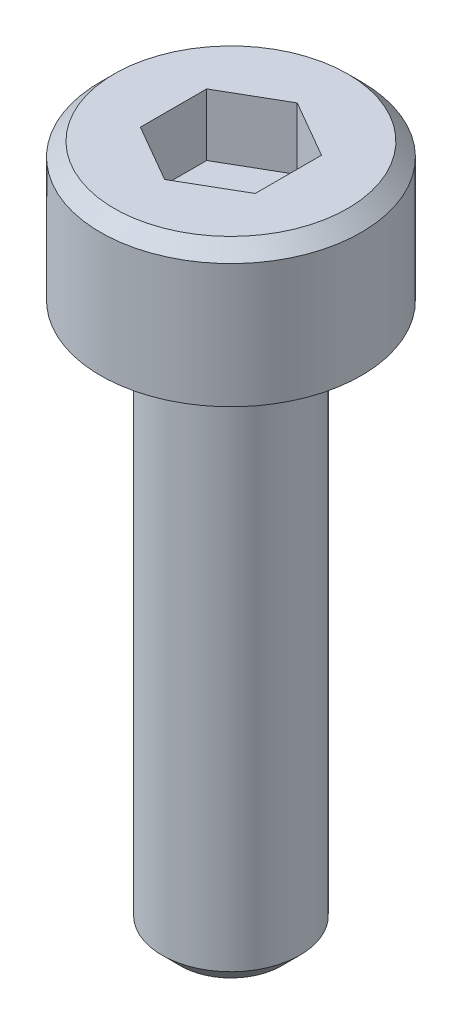
ISO-10303-21;
HEADER;
FILE_DESCRIPTION(('STEP AP214'),'2;1');
FILE_NAME('part.step','',(''),(''),'','','');
FILE_SCHEMA(('AUTOMOTIVE_DESIGN { 1 0 10303 214 1 1 1 1 }'));
ENDSEC;
DATA;
#1=APPLICATION_CONTEXT('core data for automotive mechanical design processes');
#2=APPLICATION_PROTOCOL_DEFINITION('international standard','automotive_design',2000,#1);
#3=PRODUCT_CONTEXT('',#1,'mechanical');
#4=PRODUCT('Part','Part','',(#3));
#5=PRODUCT_RELATED_PRODUCT_CATEGORY('part','',(#4));
#6=PRODUCT_DEFINITION_FORMATION('','',#4);
#7=PRODUCT_DEFINITION_CONTEXT('part definition',#1,'design');
#8=PRODUCT_DEFINITION('design','',#6,#7);
#9=PRODUCT_DEFINITION_SHAPE('','',#8);
#10=(LENGTH_UNIT() NAMED_UNIT(*) SI_UNIT(.MILLI.,.METRE.));
#11=(NAMED_UNIT(*) PLANE_ANGLE_UNIT() SI_UNIT($,.RADIAN.));
#12=(NAMED_UNIT(*) SI_UNIT($,.STERADIAN.) SOLID_ANGLE_UNIT());
#13=UNCERTAINTY_MEASURE_WITH_UNIT(LENGTH_MEASURE(1.E-05),#10,'distance_accuracy_value','');
#14=(GEOMETRIC_REPRESENTATION_CONTEXT(3) GLOBAL_UNCERTAINTY_ASSIGNED_CONTEXT((#13)) GLOBAL_UNIT_ASSIGNED_CONTEXT((#10,
#11,#12)) REPRESENTATION_CONTEXT('',''));
#15=CARTESIAN_POINT('',(0.,0.,0.));
#16=DIRECTION('',(0.,0.,1.));
#17=DIRECTION('',(1.,0.,0.));
#18=AXIS2_PLACEMENT_3D('',#15,#16,#17);
#19=CARTESIAN_POINT('',(0.,-12.,0.));
#20=DIRECTION('',(0.,-1.,0.));
#21=DIRECTION('',(0.,0.,-1.));
#22=AXIS2_PLACEMENT_3D('',#19,#20,#21);
#23=PLANE('',#22);
#24=CARTESIAN_POINT('',(0.,-12.,0.));
#25=DIRECTION('',(0.,-1.,0.));
#26=DIRECTION('',(0.,0.,-1.));
#27=AXIS2_PLACEMENT_3D('',#24,#25,#26);
#28=CIRCLE('',#27,1.1);
#29=CARTESIAN_POINT('',(0.,-12.,-1.1));
#30=VERTEX_POINT('',#29);
#31=EDGE_CURVE('E11',#30,#30,#28,.T.);
#32=ORIENTED_EDGE('',*,*,#31,.T.);
#33=EDGE_LOOP('',(#32));
#34=FACE_BOUND('',#33,.T.);
#35=ADVANCED_FACE('F41',(#34),#23,.T.);
#36=CARTESIAN_POINT('',(0.,-12.,0.));
#37=DIRECTION('',(0.,1.,0.));
#38=DIRECTION('',(0.,0.,1.));
#39=AXIS2_PLACEMENT_3D('',#36,#37,#38);
#40=CONICAL_SURFACE('',#39,1.1,0.785398163397449);
#41=CARTESIAN_POINT('',(0.,-11.6,0.));
#42=DIRECTION('',(0.,-1.,0.));
#43=DIRECTION('',(0.,0.,-1.));
#44=AXIS2_PLACEMENT_3D('',#41,#42,#43);
#45=CIRCLE('',#44,1.5);
#46=CARTESIAN_POINT('',(0.,-11.6,-1.5));
#47=VERTEX_POINT('',#46);
#48=EDGE_CURVE('E48',#47,#47,#45,.T.);
#49=ORIENTED_EDGE('',*,*,#48,.T.);
#50=EDGE_LOOP('',(#49));
#51=FACE_BOUND('',#50,.T.);
#52=ORIENTED_EDGE('',*,*,#31,.F.);
#53=EDGE_LOOP('',(#52));
#54=FACE_BOUND('',#53,.T.);
#55=ADVANCED_FACE('F161',(#51,#54),#40,.T.);
#56=CARTESIAN_POINT('',(0.,-10.,0.));
#57=DIRECTION('',(0.,-1.,0.));
#58=DIRECTION('',(0.,0.,-1.));
#59=AXIS2_PLACEMENT_3D('',#56,#57,#58);
#60=CYLINDRICAL_SURFACE('',#59,1.5);
#61=CARTESIAN_POINT('',(0.,0.,0.));
#62=DIRECTION('',(0.,-1.,0.));
#63=DIRECTION('',(0.,0.,-1.));
#64=AXIS2_PLACEMENT_3D('',#61,#62,#63);
#65=CIRCLE('',#64,1.5);
#66=CARTESIAN_POINT('',(0.,0.,-1.5));
#67=VERTEX_POINT('',#66);
#68=EDGE_CURVE('E156',#67,#67,#65,.T.);
#69=ORIENTED_EDGE('',*,*,#68,.T.);
#70=EDGE_LOOP('',(#69));
#71=FACE_BOUND('',#70,.T.);
#72=ORIENTED_EDGE('',*,*,#48,.F.);
#73=EDGE_LOOP('',(#72));
#74=FACE_BOUND('',#73,.T.);
#75=ADVANCED_FACE('F164',(#71,#74),#60,.T.);
#76=CARTESIAN_POINT('',(1.5,0.,0.));
#77=DIRECTION('',(0.,-1.,0.));
#78=DIRECTION('',(0.,0.,-1.));
#79=AXIS2_PLACEMENT_3D('',#76,#77,#78);
#80=PLANE('',#79);
#81=CARTESIAN_POINT('',(0.,0.,0.));
#82=DIRECTION('',(0.,-1.,0.));
#83=DIRECTION('',(0.,0.,-1.));
#84=AXIS2_PLACEMENT_3D('',#81,#82,#83);
#85=CIRCLE('',#84,2.84);
#86=CARTESIAN_POINT('',(0.,0.,-2.84));
#87=VERTEX_POINT('',#86);
#88=EDGE_CURVE('E153',#87,#87,#85,.T.);
#89=ORIENTED_EDGE('',*,*,#88,.T.);
#90=EDGE_LOOP('',(#89));
#91=FACE_BOUND('',#90,.T.);
#92=ORIENTED_EDGE('',*,*,#68,.F.);
#93=EDGE_LOOP('',(#92));
#94=FACE_BOUND('',#93,.T.);
#95=ADVANCED_FACE('F166',(#91,#94),#80,.T.);
#96=CARTESIAN_POINT('',(0.,-10.,0.));
#97=DIRECTION('',(0.,-1.,0.));
#98=DIRECTION('',(0.,0.,-1.));
#99=AXIS2_PLACEMENT_3D('',#96,#97,#98);
#100=CYLINDRICAL_SURFACE('',#99,2.84);
#101=CARTESIAN_POINT('',(0.,2.7,0.));
#102=DIRECTION('',(0.,-1.,0.));
#103=DIRECTION('',(0.,0.,-1.));
#104=AXIS2_PLACEMENT_3D('',#101,#102,#103);
#105=CIRCLE('',#104,2.84);
#106=CARTESIAN_POINT('',(0.,2.7,-2.84));
#107=VERTEX_POINT('',#106);
#108=EDGE_CURVE('E150',#107,#107,#105,.T.);
#109=ORIENTED_EDGE('',*,*,#108,.T.);
#110=EDGE_LOOP('',(#109));
#111=FACE_BOUND('',#110,.T.);
#112=ORIENTED_EDGE('',*,*,#88,.F.);
#113=EDGE_LOOP('',(#112));
#114=FACE_BOUND('',#113,.T.);
#115=ADVANCED_FACE('F172',(#111,#114),#100,.T.);
#116=CARTESIAN_POINT('',(0.,2.7,0.));
#117=DIRECTION('',(0.,-1.,0.));
#118=DIRECTION('',(0.,0.,-1.));
#119=AXIS2_PLACEMENT_3D('',#116,#117,#118);
#120=CONICAL_SURFACE('',#119,2.84,0.785398163397445);
#121=CARTESIAN_POINT('',(0.,3.,0.));
#122=DIRECTION('',(0.,-1.,0.));
#123=DIRECTION('',(0.,0.,-1.));
#124=AXIS2_PLACEMENT_3D('',#121,#122,#123);
#125=CIRCLE('',#124,2.54);
#126=CARTESIAN_POINT('',(0.,3.,-2.54));
#127=VERTEX_POINT('',#126);
#128=EDGE_CURVE('E142',#127,#127,#125,.T.);
#129=ORIENTED_EDGE('',*,*,#128,.T.);
#130=EDGE_LOOP('',(#129));
#131=FACE_BOUND('',#130,.T.);
#132=ORIENTED_EDGE('',*,*,#108,.F.);
#133=EDGE_LOOP('',(#132));
#134=FACE_BOUND('',#133,.T.);
#135=ADVANCED_FACE('F207',(#131,#134),#120,.T.);
#136=CARTESIAN_POINT('',(2.54,3.,0.));
#137=DIRECTION('',(0.,1.,0.));
#138=DIRECTION('',(0.,0.,1.));
#139=AXIS2_PLACEMENT_3D('',#136,#137,#138);
#140=PLANE('',#139);
#141=DIRECTION('',(0.,0.,-1.));
#142=VECTOR('',#141,1.);
#143=CARTESIAN_POINT('',(1.25,3.,-0.721687836487032));
#144=LINE('',#143,#142);
#145=CARTESIAN_POINT('',(1.25,3.,0.721687836487032));
#146=VERTEX_POINT('',#145);
#147=CARTESIAN_POINT('',(1.25,3.,-0.721687836487032));
#148=VERTEX_POINT('',#147);
#149=EDGE_CURVE('E55',#146,#148,#144,.T.);
#150=ORIENTED_EDGE('',*,*,#149,.F.);
#151=DIRECTION('',(0.866025403784439,0.,-0.5));
#152=VECTOR('',#151,1.);
#153=CARTESIAN_POINT('',(1.25,3.,0.721687836487032));
#154=LINE('',#153,#152);
#155=CARTESIAN_POINT('',(0.,3.,1.44337567297406));
#156=VERTEX_POINT('',#155);
#157=EDGE_CURVE('E138',#156,#146,#154,.T.);
#158=ORIENTED_EDGE('',*,*,#157,.F.);
#159=DIRECTION('',(0.866025403784439,0.,0.5));
#160=VECTOR('',#159,1.);
#161=CARTESIAN_POINT('',(0.,3.,1.44337567297406));
#162=LINE('',#161,#160);
#163=CARTESIAN_POINT('',(-1.25,3.,0.721687836487033));
#164=VERTEX_POINT('',#163);
#165=EDGE_CURVE('E136',#164,#156,#162,.T.);
#166=ORIENTED_EDGE('',*,*,#165,.F.);
#167=DIRECTION('',(0.,0.,1.));
#168=VECTOR('',#167,1.);
#169=CARTESIAN_POINT('',(-1.25,3.,0.721687836487033));
#170=LINE('',#169,#168);
#171=CARTESIAN_POINT('',(-1.25,3.,-0.721687836487032));
#172=VERTEX_POINT('',#171);
#173=EDGE_CURVE('E103',#172,#164,#170,.T.);
#174=ORIENTED_EDGE('',*,*,#173,.F.);
#175=DIRECTION('',(-0.866025403784438,0.,0.5));
#176=VECTOR('',#175,1.);
#177=CARTESIAN_POINT('',(-1.25,3.,-0.721687836487032));
#178=LINE('',#177,#176);
#179=CARTESIAN_POINT('',(0.,3.,-1.44337567297406));
#180=VERTEX_POINT('',#179);
#181=EDGE_CURVE('E132',#180,#172,#178,.T.);
#182=ORIENTED_EDGE('',*,*,#181,.F.);
#183=DIRECTION('',(-0.866025403784439,0.,-0.5));
#184=VECTOR('',#183,1.);
#185=CARTESIAN_POINT('',(0.,3.,-1.44337567297406));
#186=LINE('',#185,#184);
#187=EDGE_CURVE('E129',#148,#180,#186,.T.);
#188=ORIENTED_EDGE('',*,*,#187,.F.);
#189=EDGE_LOOP('',(#150,#158,#166,#174,#182,#188));
#190=FACE_BOUND('',#189,.T.);
#191=ORIENTED_EDGE('',*,*,#128,.F.);
#192=EDGE_LOOP('',(#191));
#193=FACE_BOUND('',#192,.T.);
#194=ADVANCED_FACE('F216',(#190,#193),#140,.T.);
#195=CARTESIAN_POINT('',(1.25,1.65,-0.721687836487032));
#196=DIRECTION('',(1.,0.,0.));
#197=DIRECTION('',(0.,0.,-1.));
#198=AXIS2_PLACEMENT_3D('',#195,#196,#197);
#199=PLANE('',#198);
#200=ORIENTED_EDGE('',*,*,#149,.T.);
#201=DIRECTION('',(0.,1.,0.));
#202=VECTOR('',#201,1.);
#203=CARTESIAN_POINT('',(1.25,1.65,-0.721687836487032));
#204=LINE('',#203,#202);
#205=CARTESIAN_POINT('',(1.25,1.65,-0.721687836487032));
#206=VERTEX_POINT('',#205);
#207=EDGE_CURVE('E85',#206,#148,#204,.T.);
#208=ORIENTED_EDGE('',*,*,#207,.F.);
#209=DIRECTION('',(0.,0.,-1.));
#210=VECTOR('',#209,1.);
#211=CARTESIAN_POINT('',(1.25,1.65,-0.721687836487032));
#212=LINE('',#211,#210);
#213=CARTESIAN_POINT('',(1.25,1.65,0.721687836487032));
#214=VERTEX_POINT('',#213);
#215=EDGE_CURVE('E140',#214,#206,#212,.T.);
#216=ORIENTED_EDGE('',*,*,#215,.F.);
#217=DIRECTION('',(0.,1.,0.));
#218=VECTOR('',#217,1.);
#219=CARTESIAN_POINT('',(1.25,1.65,0.721687836487032));
#220=LINE('',#219,#218);
#221=EDGE_CURVE('E63',#214,#146,#220,.T.);
#222=ORIENTED_EDGE('',*,*,#221,.T.);
#223=EDGE_LOOP('',(#200,#208,#216,#222));
#224=FACE_BOUND('',#223,.T.);
#225=ADVANCED_FACE('F225',(#224),#199,.F.);
#226=CARTESIAN_POINT('',(1.25,1.65,0.721687836487032));
#227=DIRECTION('',(0.5,0.,0.866025403784439));
#228=DIRECTION('',(0.866025403784439,0.,-0.5));
#229=AXIS2_PLACEMENT_3D('',#226,#227,#228);
#230=PLANE('',#229);
#231=ORIENTED_EDGE('',*,*,#157,.T.);
#232=ORIENTED_EDGE('',*,*,#221,.F.);
#233=DIRECTION('',(0.866025403784439,0.,-0.5));
#234=VECTOR('',#233,1.);
#235=CARTESIAN_POINT('',(1.25,1.65,0.721687836487032));
#236=LINE('',#235,#234);
#237=CARTESIAN_POINT('',(0.,1.65,1.44337567297406));
#238=VERTEX_POINT('',#237);
#239=EDGE_CURVE('E115',#238,#214,#236,.T.);
#240=ORIENTED_EDGE('',*,*,#239,.F.);
#241=DIRECTION('',(0.,1.,0.));
#242=VECTOR('',#241,1.);
#243=CARTESIAN_POINT('',(0.,1.65,1.44337567297406));
#244=LINE('',#243,#242);
#245=EDGE_CURVE('E107',#238,#156,#244,.T.);
#246=ORIENTED_EDGE('',*,*,#245,.T.);
#247=EDGE_LOOP('',(#231,#232,#240,#246));
#248=FACE_BOUND('',#247,.T.);
#249=ADVANCED_FACE('F234',(#248),#230,.F.);
#250=CARTESIAN_POINT('',(0.,1.65,1.44337567297406));
#251=DIRECTION('',(-0.5,0.,0.866025403784439));
#252=DIRECTION('',(0.866025403784439,0.,0.5));
#253=AXIS2_PLACEMENT_3D('',#250,#251,#252);
#254=PLANE('',#253);
#255=ORIENTED_EDGE('',*,*,#165,.T.);
#256=ORIENTED_EDGE('',*,*,#245,.F.);
#257=DIRECTION('',(0.866025403784439,0.,0.5));
#258=VECTOR('',#257,1.);
#259=CARTESIAN_POINT('',(0.,1.65,1.44337567297406));
#260=LINE('',#259,#258);
#261=CARTESIAN_POINT('',(-1.25,1.65,0.721687836487033));
#262=VERTEX_POINT('',#261);
#263=EDGE_CURVE('E111',#262,#238,#260,.T.);
#264=ORIENTED_EDGE('',*,*,#263,.F.);
#265=DIRECTION('',(0.,1.,0.));
#266=VECTOR('',#265,1.);
#267=CARTESIAN_POINT('',(-1.25,1.65,0.721687836487033));
#268=LINE('',#267,#266);
#269=EDGE_CURVE('E96',#262,#164,#268,.T.);
#270=ORIENTED_EDGE('',*,*,#269,.T.);
#271=EDGE_LOOP('',(#255,#256,#264,#270));
#272=FACE_BOUND('',#271,.T.);
#273=ADVANCED_FACE('F112',(#272),#254,.F.);
#274=CARTESIAN_POINT('',(-1.25,1.65,0.721687836487033));
#275=DIRECTION('',(-1.,0.,0.));
#276=DIRECTION('',(0.,0.,1.));
#277=AXIS2_PLACEMENT_3D('',#274,#275,#276);
#278=PLANE('',#277);
#279=ORIENTED_EDGE('',*,*,#173,.T.);
#280=ORIENTED_EDGE('',*,*,#269,.F.);
#281=DIRECTION('',(0.,0.,1.));
#282=VECTOR('',#281,1.);
#283=CARTESIAN_POINT('',(-1.25,1.65,0.721687836487033));
#284=LINE('',#283,#282);
#285=CARTESIAN_POINT('',(-1.25,1.65,-0.721687836487032));
#286=VERTEX_POINT('',#285);
#287=EDGE_CURVE('E100',#286,#262,#284,.T.);
#288=ORIENTED_EDGE('',*,*,#287,.F.);
#289=DIRECTION('',(0.,1.,0.));
#290=VECTOR('',#289,1.);
#291=CARTESIAN_POINT('',(-1.25,1.65,-0.721687836487032));
#292=LINE('',#291,#290);
#293=EDGE_CURVE('E108',#286,#172,#292,.T.);
#294=ORIENTED_EDGE('',*,*,#293,.T.);
#295=EDGE_LOOP('',(#279,#280,#288,#294));
#296=FACE_BOUND('',#295,.T.);
#297=ADVANCED_FACE('F98',(#296),#278,.F.);
#298=CARTESIAN_POINT('',(-1.25,1.65,-0.721687836487032));
#299=DIRECTION('',(-0.5,0.,-0.866025403784438));
#300=DIRECTION('',(-0.866025403784439,0.,0.5));
#301=AXIS2_PLACEMENT_3D('',#298,#299,#300);
#302=PLANE('',#301);
#303=ORIENTED_EDGE('',*,*,#181,.T.);
#304=ORIENTED_EDGE('',*,*,#293,.F.);
#305=DIRECTION('',(-0.866025403784438,0.,0.5));
#306=VECTOR('',#305,1.);
#307=CARTESIAN_POINT('',(-1.25,1.65,-0.721687836487032));
#308=LINE('',#307,#306);
#309=CARTESIAN_POINT('',(0.,1.65,-1.44337567297406));
#310=VERTEX_POINT('',#309);
#311=EDGE_CURVE('E121',#310,#286,#308,.T.);
#312=ORIENTED_EDGE('',*,*,#311,.F.);
#313=DIRECTION('',(0.,1.,0.));
#314=VECTOR('',#313,1.);
#315=CARTESIAN_POINT('',(0.,1.65,-1.44337567297406));
#316=LINE('',#315,#314);
#317=EDGE_CURVE('E145',#310,#180,#316,.T.);
#318=ORIENTED_EDGE('',*,*,#317,.T.);
#319=EDGE_LOOP('',(#303,#304,#312,#318));
#320=FACE_BOUND('',#319,.T.);
#321=ADVANCED_FACE('F256',(#320),#302,.F.);
#322=CARTESIAN_POINT('',(0.,1.65,-1.44337567297406));
#323=DIRECTION('',(0.5,0.,-0.866025403784439));
#324=DIRECTION('',(-0.866025403784439,0.,-0.5));
#325=AXIS2_PLACEMENT_3D('',#322,#323,#324);
#326=PLANE('',#325);
#327=ORIENTED_EDGE('',*,*,#187,.T.);
#328=ORIENTED_EDGE('',*,*,#317,.F.);
#329=DIRECTION('',(-0.866025403784439,0.,-0.5));
#330=VECTOR('',#329,1.);
#331=CARTESIAN_POINT('',(0.,1.65,-1.44337567297406));
#332=LINE('',#331,#330);
#333=EDGE_CURVE('E123',#206,#310,#332,.T.);
#334=ORIENTED_EDGE('',*,*,#333,.F.);
#335=ORIENTED_EDGE('',*,*,#207,.T.);
#336=EDGE_LOOP('',(#327,#328,#334,#335));
#337=FACE_BOUND('',#336,.T.);
#338=ADVANCED_FACE('F264',(#337),#326,.F.);
#339=CARTESIAN_POINT('',(0.,1.65,0.));
#340=DIRECTION('',(0.,-1.,0.));
#341=DIRECTION('',(0.,0.,-1.));
#342=AXIS2_PLACEMENT_3D('',#339,#340,#341);
#343=PLANE('',#342);
#344=ORIENTED_EDGE('',*,*,#215,.T.);
#345=ORIENTED_EDGE('',*,*,#333,.T.);
#346=ORIENTED_EDGE('',*,*,#311,.T.);
#347=ORIENTED_EDGE('',*,*,#287,.T.);
#348=ORIENTED_EDGE('',*,*,#263,.T.);
#349=ORIENTED_EDGE('',*,*,#239,.T.);
#350=EDGE_LOOP('',(#344,#345,#346,#347,#348,#349));
#351=FACE_BOUND('',#350,.T.);
#352=ADVANCED_FACE('F118',(#351),#343,.F.);
#353=CLOSED_SHELL('',(#35,#55,#75,#95,#115,#135,#194,#225,#249,#273,#297,#321,#338,#352));
#354=MANIFOLD_SOLID_BREP('B2',#353);
#355=ADVANCED_BREP_SHAPE_REPRESENTATION('',(#18,#354),#14);
#356=SHAPE_DEFINITION_REPRESENTATION(#9,#355);
ENDSEC;
END-ISO-10303-21;
